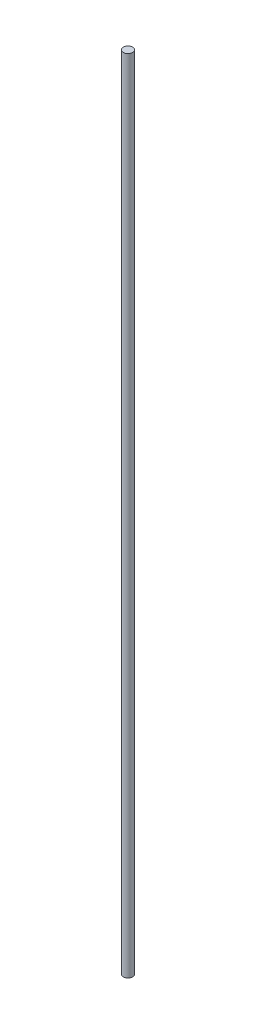
ISO-10303-21;
HEADER;
FILE_DESCRIPTION(('STEP AP214'),'2;1');
FILE_NAME('part.step','',(''),(''),'','','');
FILE_SCHEMA(('AUTOMOTIVE_DESIGN { 1 0 10303 214 1 1 1 1 }'));
ENDSEC;
DATA;
#1=APPLICATION_CONTEXT('core data for automotive mechanical design processes');
#2=APPLICATION_PROTOCOL_DEFINITION('international standard','automotive_design',2000,#1);
#3=PRODUCT_CONTEXT('',#1,'mechanical');
#4=PRODUCT('Part','Part','',(#3));
#5=PRODUCT_RELATED_PRODUCT_CATEGORY('part','',(#4));
#6=PRODUCT_DEFINITION_FORMATION('','',#4);
#7=PRODUCT_DEFINITION_CONTEXT('part definition',#1,'design');
#8=PRODUCT_DEFINITION('design','',#6,#7);
#9=PRODUCT_DEFINITION_SHAPE('','',#8);
#10=(LENGTH_UNIT() NAMED_UNIT(*) SI_UNIT(.MILLI.,.METRE.));
#11=(NAMED_UNIT(*) PLANE_ANGLE_UNIT() SI_UNIT($,.RADIAN.));
#12=(NAMED_UNIT(*) SI_UNIT($,.STERADIAN.) SOLID_ANGLE_UNIT());
#13=UNCERTAINTY_MEASURE_WITH_UNIT(LENGTH_MEASURE(1.E-05),#10,'distance_accuracy_value','');
#14=(GEOMETRIC_REPRESENTATION_CONTEXT(3) GLOBAL_UNCERTAINTY_ASSIGNED_CONTEXT((#13)) GLOBAL_UNIT_ASSIGNED_CONTEXT((#10,
#11,#12)) REPRESENTATION_CONTEXT('',''));
#15=CARTESIAN_POINT('',(0.,0.,0.));
#16=DIRECTION('',(0.,0.,1.));
#17=DIRECTION('',(1.,0.,0.));
#18=AXIS2_PLACEMENT_3D('',#15,#16,#17);
#19=CARTESIAN_POINT('',(0.,215.,0.));
#20=DIRECTION('',(0.,-1.,0.));
#21=DIRECTION('',(0.,0.,-1.));
#22=AXIS2_PLACEMENT_3D('',#19,#20,#21);
#23=CYLINDRICAL_SURFACE('',#22,2.5);
#24=CARTESIAN_POINT('',(0.,215.,0.));
#25=DIRECTION('',(0.,1.,0.));
#26=DIRECTION('',(0.,0.,1.));
#27=AXIS2_PLACEMENT_3D('',#24,#25,#26);
#28=CIRCLE('',#27,2.5);
#29=CARTESIAN_POINT('',(0.,215.,2.5));
#30=VERTEX_POINT('',#29);
#31=EDGE_CURVE('E10',#30,#30,#28,.T.);
#32=ORIENTED_EDGE('',*,*,#31,.F.);
#33=EDGE_LOOP('',(#32));
#34=FACE_BOUND('',#33,.T.);
#35=CARTESIAN_POINT('',(0.,-215.,0.));
#36=DIRECTION('',(0.,1.,0.));
#37=DIRECTION('',(0.,0.,1.));
#38=AXIS2_PLACEMENT_3D('',#35,#36,#37);
#39=CIRCLE('',#38,2.5);
#40=CARTESIAN_POINT('',(0.,-215.,2.5));
#41=VERTEX_POINT('',#40);
#42=EDGE_CURVE('E46',#41,#41,#39,.T.);
#43=ORIENTED_EDGE('',*,*,#42,.T.);
#44=EDGE_LOOP('',(#43));
#45=FACE_BOUND('',#44,.T.);
#46=ADVANCED_FACE('F43',(#34,#45),#23,.T.);
#47=CARTESIAN_POINT('',(0.,215.,0.));
#48=DIRECTION('',(0.,1.,0.));
#49=DIRECTION('',(0.,0.,1.));
#50=AXIS2_PLACEMENT_3D('',#47,#48,#49);
#51=PLANE('',#50);
#52=ORIENTED_EDGE('',*,*,#31,.T.);
#53=EDGE_LOOP('',(#52));
#54=FACE_BOUND('',#53,.T.);
#55=ADVANCED_FACE('F60',(#54),#51,.T.);
#56=CARTESIAN_POINT('',(0.,-215.,0.));
#57=DIRECTION('',(0.,1.,0.));
#58=DIRECTION('',(0.,0.,1.));
#59=AXIS2_PLACEMENT_3D('',#56,#57,#58);
#60=PLANE('',#59);
#61=ORIENTED_EDGE('',*,*,#42,.F.);
#62=EDGE_LOOP('',(#61));
#63=FACE_BOUND('',#62,.T.);
#64=ADVANCED_FACE('F58',(#63),#60,.F.);
#65=CLOSED_SHELL('',(#46,#55,#64));
#66=MANIFOLD_SOLID_BREP('B2',#65);
#67=ADVANCED_BREP_SHAPE_REPRESENTATION('',(#18,#66),#14);
#68=SHAPE_DEFINITION_REPRESENTATION(#9,#67);
ENDSEC;
END-ISO-10303-21;
